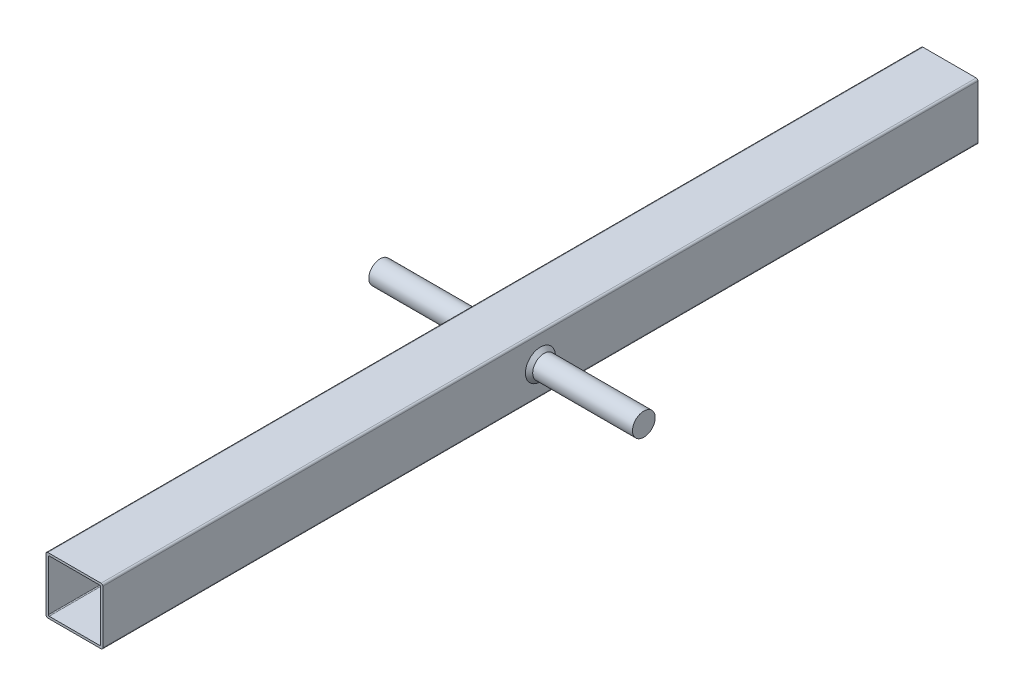
ISO-10303-21;
HEADER;
FILE_DESCRIPTION(('STEP AP214'),'2;1');
FILE_NAME('part.step','',(''),(''),'','','');
FILE_SCHEMA(('AUTOMOTIVE_DESIGN { 1 0 10303 214 1 1 1 1 }'));
ENDSEC;
DATA;
#1=APPLICATION_CONTEXT('core data for automotive mechanical design processes');
#2=APPLICATION_PROTOCOL_DEFINITION('international standard','automotive_design',2000,#1);
#3=PRODUCT_CONTEXT('',#1,'mechanical');
#4=PRODUCT('Part','Part','',(#3));
#5=PRODUCT_RELATED_PRODUCT_CATEGORY('part','',(#4));
#6=PRODUCT_DEFINITION_FORMATION('','',#4);
#7=PRODUCT_DEFINITION_CONTEXT('part definition',#1,'design');
#8=PRODUCT_DEFINITION('design','',#6,#7);
#9=PRODUCT_DEFINITION_SHAPE('','',#8);
#10=(LENGTH_UNIT() NAMED_UNIT(*) SI_UNIT(.MILLI.,.METRE.));
#11=(NAMED_UNIT(*) PLANE_ANGLE_UNIT() SI_UNIT($,.RADIAN.));
#12=(NAMED_UNIT(*) SI_UNIT($,.STERADIAN.) SOLID_ANGLE_UNIT());
#13=UNCERTAINTY_MEASURE_WITH_UNIT(LENGTH_MEASURE(1.E-05),#10,'distance_accuracy_value','');
#14=(GEOMETRIC_REPRESENTATION_CONTEXT(3) GLOBAL_UNCERTAINTY_ASSIGNED_CONTEXT((#13)) GLOBAL_UNIT_ASSIGNED_CONTEXT((#10,
#11,#12)) REPRESENTATION_CONTEXT('',''));
#15=CARTESIAN_POINT('',(0.,0.,0.));
#16=DIRECTION('',(0.,0.,1.));
#17=DIRECTION('',(1.,0.,0.));
#18=AXIS2_PLACEMENT_3D('',#15,#16,#17);
#19=CARTESIAN_POINT('',(0.,0.,305.59375));
#20=DIRECTION('',(0.,0.,1.));
#21=DIRECTION('',(1.,0.,0.));
#22=AXIS2_PLACEMENT_3D('',#19,#20,#21);
#23=PLANE('',#22);
#24=DIRECTION('',(1.,0.,0.));
#25=VECTOR('',#24,1.);
#26=CARTESIAN_POINT('',(19.84375,-19.84375,305.59375));
#27=LINE('',#26,#25);
#28=CARTESIAN_POINT('',(-18.57375,-19.84375,305.59375));
#29=VERTEX_POINT('',#28);
#30=CARTESIAN_POINT('',(18.57375,-19.84375,305.59375));
#31=VERTEX_POINT('',#30);
#32=EDGE_CURVE('E383',#29,#31,#27,.T.);
#33=ORIENTED_EDGE('',*,*,#32,.T.);
#34=CARTESIAN_POINT('',(18.57375,-18.57375,305.59375));
#35=DIRECTION('',(0.,0.,1.));
#36=DIRECTION('',(1.,0.,0.));
#37=AXIS2_PLACEMENT_3D('',#34,#35,#36);
#38=CIRCLE('',#37,1.27);
#39=CARTESIAN_POINT('',(19.84375,-18.57375,305.59375));
#40=VERTEX_POINT('',#39);
#41=EDGE_CURVE('E207',#31,#40,#38,.T.);
#42=ORIENTED_EDGE('',*,*,#41,.T.);
#43=DIRECTION('',(0.,1.,0.));
#44=VECTOR('',#43,1.);
#45=CARTESIAN_POINT('',(19.84375,-19.84375,305.59375));
#46=LINE('',#45,#44);
#47=CARTESIAN_POINT('',(19.84375,18.57375,305.59375));
#48=VERTEX_POINT('',#47);
#49=EDGE_CURVE('E175',#40,#48,#46,.T.);
#50=ORIENTED_EDGE('',*,*,#49,.T.);
#51=CARTESIAN_POINT('',(18.57375,18.57375,305.59375));
#52=DIRECTION('',(0.,0.,1.));
#53=DIRECTION('',(1.,0.,0.));
#54=AXIS2_PLACEMENT_3D('',#51,#52,#53);
#55=CIRCLE('',#54,1.27);
#56=CARTESIAN_POINT('',(18.57375,19.84375,305.59375));
#57=VERTEX_POINT('',#56);
#58=EDGE_CURVE('E201',#48,#57,#55,.T.);
#59=ORIENTED_EDGE('',*,*,#58,.T.);
#60=DIRECTION('',(-1.,0.,0.));
#61=VECTOR('',#60,1.);
#62=CARTESIAN_POINT('',(19.84375,19.84375,305.59375));
#63=LINE('',#62,#61);
#64=CARTESIAN_POINT('',(-18.57375,19.84375,305.59375));
#65=VERTEX_POINT('',#64);
#66=EDGE_CURVE('E192',#57,#65,#63,.T.);
#67=ORIENTED_EDGE('',*,*,#66,.T.);
#68=CARTESIAN_POINT('',(-18.57375,18.57375,305.59375));
#69=DIRECTION('',(0.,0.,1.));
#70=DIRECTION('',(1.,0.,0.));
#71=AXIS2_PLACEMENT_3D('',#68,#69,#70);
#72=CIRCLE('',#71,1.27);
#73=CARTESIAN_POINT('',(-19.84375,18.57375,305.59375));
#74=VERTEX_POINT('',#73);
#75=EDGE_CURVE('E203',#65,#74,#72,.T.);
#76=ORIENTED_EDGE('',*,*,#75,.T.);
#77=DIRECTION('',(0.,-1.,0.));
#78=VECTOR('',#77,1.);
#79=CARTESIAN_POINT('',(-19.84375,-19.84375,305.59375));
#80=LINE('',#79,#78);
#81=CARTESIAN_POINT('',(-19.84375,-18.57375,305.59375));
#82=VERTEX_POINT('',#81);
#83=EDGE_CURVE('E186',#74,#82,#80,.T.);
#84=ORIENTED_EDGE('',*,*,#83,.T.);
#85=CARTESIAN_POINT('',(-18.57375,-18.57375,305.59375));
#86=DIRECTION('',(0.,0.,1.));
#87=DIRECTION('',(1.,0.,0.));
#88=AXIS2_PLACEMENT_3D('',#85,#86,#87);
#89=CIRCLE('',#88,1.27);
#90=EDGE_CURVE('E205',#82,#29,#89,.T.);
#91=ORIENTED_EDGE('',*,*,#90,.T.);
#92=EDGE_LOOP('',(#33,#42,#50,#59,#67,#76,#84,#91));
#93=FACE_BOUND('',#92,.T.);
#94=DIRECTION('',(-1.,0.,0.));
#95=VECTOR('',#94,1.);
#96=CARTESIAN_POINT('',(-18.25625,18.25625,305.59375));
#97=LINE('',#96,#95);
#98=CARTESIAN_POINT('',(17.62125,18.25625,305.59375));
#99=VERTEX_POINT('',#98);
#100=CARTESIAN_POINT('',(-17.62125,18.25625,305.59375));
#101=VERTEX_POINT('',#100);
#102=EDGE_CURVE('E352',#99,#101,#97,.T.);
#103=ORIENTED_EDGE('',*,*,#102,.F.);
#104=CARTESIAN_POINT('',(17.62125,17.62125,305.59375));
#105=DIRECTION('',(0.,0.,1.));
#106=DIRECTION('',(1.,0.,0.));
#107=AXIS2_PLACEMENT_3D('',#104,#105,#106);
#108=CIRCLE('',#107,0.635);
#109=CARTESIAN_POINT('',(18.25625,17.62125,305.59375));
#110=VERTEX_POINT('',#109);
#111=EDGE_CURVE('E244',#99,#110,#108,.F.);
#112=ORIENTED_EDGE('',*,*,#111,.T.);
#113=DIRECTION('',(0.,1.,0.));
#114=VECTOR('',#113,1.);
#115=CARTESIAN_POINT('',(18.25625,18.25625,305.59375));
#116=LINE('',#115,#114);
#117=CARTESIAN_POINT('',(18.25625,-17.62125,305.59375));
#118=VERTEX_POINT('',#117);
#119=EDGE_CURVE('E360',#118,#110,#116,.T.);
#120=ORIENTED_EDGE('',*,*,#119,.F.);
#121=CARTESIAN_POINT('',(17.62125,-17.62125,305.59375));
#122=DIRECTION('',(0.,0.,1.));
#123=DIRECTION('',(1.,0.,0.));
#124=AXIS2_PLACEMENT_3D('',#121,#122,#123);
#125=CIRCLE('',#124,0.635);
#126=CARTESIAN_POINT('',(17.62125,-18.25625,305.59375));
#127=VERTEX_POINT('',#126);
#128=EDGE_CURVE('E240',#118,#127,#125,.F.);
#129=ORIENTED_EDGE('',*,*,#128,.T.);
#130=DIRECTION('',(1.,0.,0.));
#131=VECTOR('',#130,1.);
#132=CARTESIAN_POINT('',(-18.25625,-18.25625,305.59375));
#133=LINE('',#132,#131);
#134=CARTESIAN_POINT('',(-17.62125,-18.25625,305.59375));
#135=VERTEX_POINT('',#134);
#136=EDGE_CURVE('E362',#135,#127,#133,.T.);
#137=ORIENTED_EDGE('',*,*,#136,.F.);
#138=CARTESIAN_POINT('',(-17.62125,-17.62125,305.59375));
#139=DIRECTION('',(0.,0.,1.));
#140=DIRECTION('',(1.,0.,0.));
#141=AXIS2_PLACEMENT_3D('',#138,#139,#140);
#142=CIRCLE('',#141,0.635);
#143=CARTESIAN_POINT('',(-18.25625,-17.62125,305.59375));
#144=VERTEX_POINT('',#143);
#145=EDGE_CURVE('E55',#135,#144,#142,.F.);
#146=ORIENTED_EDGE('',*,*,#145,.T.);
#147=DIRECTION('',(0.,-1.,0.));
#148=VECTOR('',#147,1.);
#149=CARTESIAN_POINT('',(-18.25625,18.25625,305.59375));
#150=LINE('',#149,#148);
#151=CARTESIAN_POINT('',(-18.25625,17.62125,305.59375));
#152=VERTEX_POINT('',#151);
#153=EDGE_CURVE('E354',#152,#144,#150,.T.);
#154=ORIENTED_EDGE('',*,*,#153,.F.);
#155=CARTESIAN_POINT('',(-17.62125,17.62125,305.59375));
#156=DIRECTION('',(0.,0.,1.));
#157=DIRECTION('',(1.,0.,0.));
#158=AXIS2_PLACEMENT_3D('',#155,#156,#157);
#159=CIRCLE('',#158,0.635);
#160=EDGE_CURVE('E251',#152,#101,#159,.F.);
#161=ORIENTED_EDGE('',*,*,#160,.T.);
#162=EDGE_LOOP('',(#103,#112,#120,#129,#137,#146,#154,#161));
#163=FACE_BOUND('',#162,.T.);
#164=ADVANCED_FACE('F39',(#93,#163),#23,.T.);
#165=CARTESIAN_POINT('',(0.,0.,-305.59375));
#166=DIRECTION('',(0.,0.,1.));
#167=DIRECTION('',(1.,0.,0.));
#168=AXIS2_PLACEMENT_3D('',#165,#166,#167);
#169=PLANE('',#168);
#170=DIRECTION('',(0.,1.,0.));
#171=VECTOR('',#170,1.);
#172=CARTESIAN_POINT('',(19.84375,-19.84375,-305.59375));
#173=LINE('',#172,#171);
#174=CARTESIAN_POINT('',(19.84375,-18.57375,-305.59375));
#175=VERTEX_POINT('',#174);
#176=CARTESIAN_POINT('',(19.84375,18.57375,-305.59375));
#177=VERTEX_POINT('',#176);
#178=EDGE_CURVE('E172',#175,#177,#173,.T.);
#179=ORIENTED_EDGE('',*,*,#178,.F.);
#180=CARTESIAN_POINT('',(18.57375,-18.57375,-305.59375));
#181=DIRECTION('',(0.,0.,1.));
#182=DIRECTION('',(1.,0.,0.));
#183=AXIS2_PLACEMENT_3D('',#180,#181,#182);
#184=CIRCLE('',#183,1.27);
#185=CARTESIAN_POINT('',(18.57375,-19.84375,-305.59375));
#186=VERTEX_POINT('',#185);
#187=EDGE_CURVE('E155',#175,#186,#184,.F.);
#188=ORIENTED_EDGE('',*,*,#187,.T.);
#189=DIRECTION('',(1.,0.,0.));
#190=VECTOR('',#189,1.);
#191=CARTESIAN_POINT('',(19.84375,-19.84375,-305.59375));
#192=LINE('',#191,#190);
#193=CARTESIAN_POINT('',(-18.57375,-19.84375,-305.59375));
#194=VERTEX_POINT('',#193);
#195=EDGE_CURVE('E183',#194,#186,#192,.T.);
#196=ORIENTED_EDGE('',*,*,#195,.F.);
#197=CARTESIAN_POINT('',(-18.57375,-18.57375,-305.59375));
#198=DIRECTION('',(0.,0.,1.));
#199=DIRECTION('',(1.,0.,0.));
#200=AXIS2_PLACEMENT_3D('',#197,#198,#199);
#201=CIRCLE('',#200,1.27);
#202=CARTESIAN_POINT('',(-19.84375,-18.57375,-305.59375));
#203=VERTEX_POINT('',#202);
#204=EDGE_CURVE('E166',#194,#203,#201,.F.);
#205=ORIENTED_EDGE('',*,*,#204,.T.);
#206=DIRECTION('',(0.,-1.,0.));
#207=VECTOR('',#206,1.);
#208=CARTESIAN_POINT('',(-19.84375,-19.84375,-305.59375));
#209=LINE('',#208,#207);
#210=CARTESIAN_POINT('',(-19.84375,18.57375,-305.59375));
#211=VERTEX_POINT('',#210);
#212=EDGE_CURVE('E188',#211,#203,#209,.T.);
#213=ORIENTED_EDGE('',*,*,#212,.F.);
#214=CARTESIAN_POINT('',(-18.57375,18.57375,-305.59375));
#215=DIRECTION('',(0.,0.,1.));
#216=DIRECTION('',(1.,0.,0.));
#217=AXIS2_PLACEMENT_3D('',#214,#215,#216);
#218=CIRCLE('',#217,1.27);
#219=CARTESIAN_POINT('',(-18.57375,19.84375,-305.59375));
#220=VERTEX_POINT('',#219);
#221=EDGE_CURVE('E195',#211,#220,#218,.F.);
#222=ORIENTED_EDGE('',*,*,#221,.T.);
#223=DIRECTION('',(-1.,0.,0.));
#224=VECTOR('',#223,1.);
#225=CARTESIAN_POINT('',(19.84375,19.84375,-305.59375));
#226=LINE('',#225,#224);
#227=CARTESIAN_POINT('',(18.57375,19.84375,-305.59375));
#228=VERTEX_POINT('',#227);
#229=EDGE_CURVE('E182',#228,#220,#226,.T.);
#230=ORIENTED_EDGE('',*,*,#229,.F.);
#231=CARTESIAN_POINT('',(18.57375,18.57375,-305.59375));
#232=DIRECTION('',(0.,0.,1.));
#233=DIRECTION('',(1.,0.,0.));
#234=AXIS2_PLACEMENT_3D('',#231,#232,#233);
#235=CIRCLE('',#234,1.27);
#236=EDGE_CURVE('E176',#228,#177,#235,.F.);
#237=ORIENTED_EDGE('',*,*,#236,.T.);
#238=EDGE_LOOP('',(#179,#188,#196,#205,#213,#222,#230,#237));
#239=FACE_BOUND('',#238,.T.);
#240=DIRECTION('',(1.,0.,0.));
#241=VECTOR('',#240,1.);
#242=CARTESIAN_POINT('',(-18.25625,-18.25625,-305.59375));
#243=LINE('',#242,#241);
#244=CARTESIAN_POINT('',(-17.62125,-18.25625,-305.59375));
#245=VERTEX_POINT('',#244);
#246=CARTESIAN_POINT('',(17.62125,-18.25625,-305.59375));
#247=VERTEX_POINT('',#246);
#248=EDGE_CURVE('E365',#245,#247,#243,.T.);
#249=ORIENTED_EDGE('',*,*,#248,.T.);
#250=CARTESIAN_POINT('',(17.62125,-17.62125,-305.59375));
#251=DIRECTION('',(0.,0.,1.));
#252=DIRECTION('',(1.,0.,0.));
#253=AXIS2_PLACEMENT_3D('',#250,#251,#252);
#254=CIRCLE('',#253,0.635);
#255=CARTESIAN_POINT('',(18.25625,-17.62125,-305.59375));
#256=VERTEX_POINT('',#255);
#257=EDGE_CURVE('E238',#247,#256,#254,.T.);
#258=ORIENTED_EDGE('',*,*,#257,.T.);
#259=DIRECTION('',(0.,1.,0.));
#260=VECTOR('',#259,1.);
#261=CARTESIAN_POINT('',(18.25625,18.25625,-305.59375));
#262=LINE('',#261,#260);
#263=CARTESIAN_POINT('',(18.25625,17.62125,-305.59375));
#264=VERTEX_POINT('',#263);
#265=EDGE_CURVE('E371',#256,#264,#262,.T.);
#266=ORIENTED_EDGE('',*,*,#265,.T.);
#267=CARTESIAN_POINT('',(17.62125,17.62125,-305.59375));
#268=DIRECTION('',(0.,0.,1.));
#269=DIRECTION('',(1.,0.,0.));
#270=AXIS2_PLACEMENT_3D('',#267,#268,#269);
#271=CIRCLE('',#270,0.635);
#272=CARTESIAN_POINT('',(17.62125,18.25625,-305.59375));
#273=VERTEX_POINT('',#272);
#274=EDGE_CURVE('E242',#264,#273,#271,.T.);
#275=ORIENTED_EDGE('',*,*,#274,.T.);
#276=DIRECTION('',(-1.,0.,0.));
#277=VECTOR('',#276,1.);
#278=CARTESIAN_POINT('',(-18.25625,18.25625,-305.59375));
#279=LINE('',#278,#277);
#280=CARTESIAN_POINT('',(-17.62125,18.25625,-305.59375));
#281=VERTEX_POINT('',#280);
#282=EDGE_CURVE('E374',#273,#281,#279,.T.);
#283=ORIENTED_EDGE('',*,*,#282,.T.);
#284=CARTESIAN_POINT('',(-17.62125,17.62125,-305.59375));
#285=DIRECTION('',(0.,0.,1.));
#286=DIRECTION('',(1.,0.,0.));
#287=AXIS2_PLACEMENT_3D('',#284,#285,#286);
#288=CIRCLE('',#287,0.635);
#289=CARTESIAN_POINT('',(-18.25625,17.62125,-305.59375));
#290=VERTEX_POINT('',#289);
#291=EDGE_CURVE('E249',#281,#290,#288,.T.);
#292=ORIENTED_EDGE('',*,*,#291,.T.);
#293=DIRECTION('',(0.,-1.,0.));
#294=VECTOR('',#293,1.);
#295=CARTESIAN_POINT('',(-18.25625,18.25625,-305.59375));
#296=LINE('',#295,#294);
#297=CARTESIAN_POINT('',(-18.25625,-17.62125,-305.59375));
#298=VERTEX_POINT('',#297);
#299=EDGE_CURVE('E376',#290,#298,#296,.T.);
#300=ORIENTED_EDGE('',*,*,#299,.T.);
#301=CARTESIAN_POINT('',(-17.62125,-17.62125,-305.59375));
#302=DIRECTION('',(0.,0.,1.));
#303=DIRECTION('',(1.,0.,0.));
#304=AXIS2_PLACEMENT_3D('',#301,#302,#303);
#305=CIRCLE('',#304,0.635);
#306=EDGE_CURVE('E246',#298,#245,#305,.T.);
#307=ORIENTED_EDGE('',*,*,#306,.T.);
#308=EDGE_LOOP('',(#249,#258,#266,#275,#283,#292,#300,#307));
#309=FACE_BOUND('',#308,.T.);
#310=ADVANCED_FACE('F179',(#239,#309),#169,.F.);
#311=CARTESIAN_POINT('',(-19.84375,-19.84375,305.59375));
#312=DIRECTION('',(1.,0.,0.));
#313=DIRECTION('',(0.,0.,-1.));
#314=AXIS2_PLACEMENT_3D('',#311,#312,#313);
#315=PLANE('',#314);
#316=CARTESIAN_POINT('',(-19.84375,0.,0.));
#317=DIRECTION('',(1.,0.,0.));
#318=DIRECTION('',(0.,0.,-1.));
#319=AXIS2_PLACEMENT_3D('',#316,#317,#318);
#320=CIRCLE('',#319,10.4774999999999);
#321=CARTESIAN_POINT('',(-19.84375,0.,-10.4774999999999));
#322=VERTEX_POINT('',#321);
#323=EDGE_CURVE('E11',#322,#322,#320,.T.);
#324=ORIENTED_EDGE('',*,*,#323,.T.);
#325=EDGE_LOOP('',(#324));
#326=FACE_BOUND('',#325,.T.);
#327=ORIENTED_EDGE('',*,*,#212,.T.);
#328=DIRECTION('',(0.,0.,-1.));
#329=VECTOR('',#328,1.);
#330=CARTESIAN_POINT('',(-19.84375,-18.57375,305.59375));
#331=LINE('',#330,#329);
#332=EDGE_CURVE('E212',#203,#82,#331,.F.);
#333=ORIENTED_EDGE('',*,*,#332,.T.);
#334=ORIENTED_EDGE('',*,*,#83,.F.);
#335=DIRECTION('',(0.,0.,-1.));
#336=VECTOR('',#335,1.);
#337=CARTESIAN_POINT('',(-19.84375,18.57375,305.59375));
#338=LINE('',#337,#336);
#339=EDGE_CURVE('E209',#74,#211,#338,.T.);
#340=ORIENTED_EDGE('',*,*,#339,.T.);
#341=EDGE_LOOP('',(#327,#333,#334,#340));
#342=FACE_BOUND('',#341,.T.);
#343=ADVANCED_FACE('F284',(#326,#342),#315,.F.);
#344=CARTESIAN_POINT('',(19.84375,-19.84375,305.59375));
#345=DIRECTION('',(0.,1.,0.));
#346=DIRECTION('',(-1.,0.,0.));
#347=AXIS2_PLACEMENT_3D('',#344,#345,#346);
#348=PLANE('',#347);
#349=ORIENTED_EDGE('',*,*,#195,.T.);
#350=DIRECTION('',(0.,0.,-1.));
#351=VECTOR('',#350,1.);
#352=CARTESIAN_POINT('',(18.57375,-19.84375,305.59375));
#353=LINE('',#352,#351);
#354=EDGE_CURVE('E160',#186,#31,#353,.F.);
#355=ORIENTED_EDGE('',*,*,#354,.T.);
#356=ORIENTED_EDGE('',*,*,#32,.F.);
#357=DIRECTION('',(0.,0.,-1.));
#358=VECTOR('',#357,1.);
#359=CARTESIAN_POINT('',(-18.57375,-19.84375,305.59375));
#360=LINE('',#359,#358);
#361=EDGE_CURVE('E165',#29,#194,#360,.T.);
#362=ORIENTED_EDGE('',*,*,#361,.T.);
#363=EDGE_LOOP('',(#349,#355,#356,#362));
#364=FACE_BOUND('',#363,.T.);
#365=ADVANCED_FACE('F297',(#364),#348,.F.);
#366=CARTESIAN_POINT('',(19.84375,-19.84375,305.59375));
#367=DIRECTION('',(-1.,0.,0.));
#368=DIRECTION('',(0.,0.,1.));
#369=AXIS2_PLACEMENT_3D('',#366,#367,#368);
#370=PLANE('',#369);
#371=CARTESIAN_POINT('',(19.84375,0.,0.));
#372=DIRECTION('',(-1.,0.,0.));
#373=DIRECTION('',(0.,0.,1.));
#374=AXIS2_PLACEMENT_3D('',#371,#372,#373);
#375=CIRCLE('',#374,10.4775);
#376=CARTESIAN_POINT('',(19.84375,0.,10.4775));
#377=VERTEX_POINT('',#376);
#378=EDGE_CURVE('E261',#377,#377,#375,.T.);
#379=ORIENTED_EDGE('',*,*,#378,.T.);
#380=EDGE_LOOP('',(#379));
#381=FACE_BOUND('',#380,.T.);
#382=ORIENTED_EDGE('',*,*,#49,.F.);
#383=DIRECTION('',(0.,0.,-1.));
#384=VECTOR('',#383,1.);
#385=CARTESIAN_POINT('',(19.84375,-18.57375,305.59375));
#386=LINE('',#385,#384);
#387=EDGE_CURVE('E159',#40,#175,#386,.T.);
#388=ORIENTED_EDGE('',*,*,#387,.T.);
#389=ORIENTED_EDGE('',*,*,#178,.T.);
#390=DIRECTION('',(0.,0.,-1.));
#391=VECTOR('',#390,1.);
#392=CARTESIAN_POINT('',(19.84375,18.57375,305.59375));
#393=LINE('',#392,#391);
#394=EDGE_CURVE('E177',#177,#48,#393,.F.);
#395=ORIENTED_EDGE('',*,*,#394,.T.);
#396=EDGE_LOOP('',(#382,#388,#389,#395));
#397=FACE_BOUND('',#396,.T.);
#398=ADVANCED_FACE('F171',(#381,#397),#370,.F.);
#399=CARTESIAN_POINT('',(19.84375,19.84375,305.59375));
#400=DIRECTION('',(0.,-1.,0.));
#401=DIRECTION('',(1.,0.,0.));
#402=AXIS2_PLACEMENT_3D('',#399,#400,#401);
#403=PLANE('',#402);
#404=ORIENTED_EDGE('',*,*,#229,.T.);
#405=DIRECTION('',(0.,0.,-1.));
#406=VECTOR('',#405,1.);
#407=CARTESIAN_POINT('',(-18.57375,19.84375,305.59375));
#408=LINE('',#407,#406);
#409=EDGE_CURVE('E217',#220,#65,#408,.F.);
#410=ORIENTED_EDGE('',*,*,#409,.T.);
#411=ORIENTED_EDGE('',*,*,#66,.F.);
#412=DIRECTION('',(0.,0.,-1.));
#413=VECTOR('',#412,1.);
#414=CARTESIAN_POINT('',(18.57375,19.84375,305.59375));
#415=LINE('',#414,#413);
#416=EDGE_CURVE('E214',#57,#228,#415,.T.);
#417=ORIENTED_EDGE('',*,*,#416,.T.);
#418=EDGE_LOOP('',(#404,#410,#411,#417));
#419=FACE_BOUND('',#418,.T.);
#420=ADVANCED_FACE('F291',(#419),#403,.F.);
#421=CARTESIAN_POINT('',(18.25625,18.25625,305.59375));
#422=DIRECTION('',(-1.,0.,0.));
#423=DIRECTION('',(0.,-1.,0.));
#424=AXIS2_PLACEMENT_3D('',#421,#422,#423);
#425=PLANE('',#424);
#426=CARTESIAN_POINT('',(18.25625,0.,0.));
#427=DIRECTION('',(-1.,0.,0.));
#428=DIRECTION('',(0.,-1.,0.));
#429=AXIS2_PLACEMENT_3D('',#426,#427,#428);
#430=CIRCLE('',#429,7.9375);
#431=CARTESIAN_POINT('',(18.25625,-7.9375,0.));
#432=VERTEX_POINT('',#431);
#433=EDGE_CURVE('E257',#432,#432,#430,.F.);
#434=ORIENTED_EDGE('',*,*,#433,.T.);
#435=EDGE_LOOP('',(#434));
#436=FACE_BOUND('',#435,.T.);
#437=ORIENTED_EDGE('',*,*,#265,.F.);
#438=DIRECTION('',(0.,0.,-1.));
#439=VECTOR('',#438,1.);
#440=CARTESIAN_POINT('',(18.25625,-17.62125,305.59375));
#441=LINE('',#440,#439);
#442=EDGE_CURVE('E227',#256,#118,#441,.F.);
#443=ORIENTED_EDGE('',*,*,#442,.T.);
#444=ORIENTED_EDGE('',*,*,#119,.T.);
#445=DIRECTION('',(0.,0.,-1.));
#446=VECTOR('',#445,1.);
#447=CARTESIAN_POINT('',(18.25625,17.62125,-305.59375));
#448=LINE('',#447,#446);
#449=EDGE_CURVE('E224',#110,#264,#448,.T.);
#450=ORIENTED_EDGE('',*,*,#449,.T.);
#451=EDGE_LOOP('',(#437,#443,#444,#450));
#452=FACE_BOUND('',#451,.T.);
#453=ADVANCED_FACE('F288',(#436,#452),#425,.T.);
#454=CARTESIAN_POINT('',(-18.25625,18.25625,305.59375));
#455=DIRECTION('',(0.,-1.,0.));
#456=DIRECTION('',(0.,0.,-1.));
#457=AXIS2_PLACEMENT_3D('',#454,#455,#456);
#458=PLANE('',#457);
#459=ORIENTED_EDGE('',*,*,#282,.F.);
#460=DIRECTION('',(0.,0.,-1.));
#461=VECTOR('',#460,1.);
#462=CARTESIAN_POINT('',(17.62125,18.25625,305.59375));
#463=LINE('',#462,#461);
#464=EDGE_CURVE('E232',#273,#99,#463,.F.);
#465=ORIENTED_EDGE('',*,*,#464,.T.);
#466=ORIENTED_EDGE('',*,*,#102,.T.);
#467=DIRECTION('',(0.,0.,-1.));
#468=VECTOR('',#467,1.);
#469=CARTESIAN_POINT('',(-17.62125,18.25625,-305.59375));
#470=LINE('',#469,#468);
#471=EDGE_CURVE('E229',#101,#281,#470,.T.);
#472=ORIENTED_EDGE('',*,*,#471,.T.);
#473=EDGE_LOOP('',(#459,#465,#466,#472));
#474=FACE_BOUND('',#473,.T.);
#475=ADVANCED_FACE('F357',(#474),#458,.T.);
#476=CARTESIAN_POINT('',(-18.25625,18.25625,305.59375));
#477=DIRECTION('',(1.,0.,0.));
#478=DIRECTION('',(0.,1.,0.));
#479=AXIS2_PLACEMENT_3D('',#476,#477,#478);
#480=PLANE('',#479);
#481=CARTESIAN_POINT('',(-18.25625,0.,0.));
#482=DIRECTION('',(1.,0.,0.));
#483=DIRECTION('',(0.,1.,0.));
#484=AXIS2_PLACEMENT_3D('',#481,#482,#483);
#485=CIRCLE('',#484,7.9375);
#486=CARTESIAN_POINT('',(-18.25625,7.9375,0.));
#487=VERTEX_POINT('',#486);
#488=EDGE_CURVE('E254',#487,#487,#485,.F.);
#489=ORIENTED_EDGE('',*,*,#488,.T.);
#490=EDGE_LOOP('',(#489));
#491=FACE_BOUND('',#490,.T.);
#492=ORIENTED_EDGE('',*,*,#153,.T.);
#493=DIRECTION('',(0.,0.,-1.));
#494=VECTOR('',#493,1.);
#495=CARTESIAN_POINT('',(-18.25625,-17.62125,-305.59375));
#496=LINE('',#495,#494);
#497=EDGE_CURVE('E235',#144,#298,#496,.T.);
#498=ORIENTED_EDGE('',*,*,#497,.T.);
#499=ORIENTED_EDGE('',*,*,#299,.F.);
#500=DIRECTION('',(0.,0.,-1.));
#501=VECTOR('',#500,1.);
#502=CARTESIAN_POINT('',(-18.25625,17.62125,305.59375));
#503=LINE('',#502,#501);
#504=EDGE_CURVE('E62',#290,#152,#503,.F.);
#505=ORIENTED_EDGE('',*,*,#504,.T.);
#506=EDGE_LOOP('',(#492,#498,#499,#505));
#507=FACE_BOUND('',#506,.T.);
#508=ADVANCED_FACE('F407',(#491,#507),#480,.T.);
#509=CARTESIAN_POINT('',(-18.25625,-18.25625,305.59375));
#510=DIRECTION('',(0.,1.,0.));
#511=DIRECTION('',(0.,0.,1.));
#512=AXIS2_PLACEMENT_3D('',#509,#510,#511);
#513=PLANE('',#512);
#514=ORIENTED_EDGE('',*,*,#136,.T.);
#515=DIRECTION('',(0.,0.,-1.));
#516=VECTOR('',#515,1.);
#517=CARTESIAN_POINT('',(17.62125,-18.25625,-305.59375));
#518=LINE('',#517,#516);
#519=EDGE_CURVE('E221',#127,#247,#518,.T.);
#520=ORIENTED_EDGE('',*,*,#519,.T.);
#521=ORIENTED_EDGE('',*,*,#248,.F.);
#522=DIRECTION('',(0.,0.,-1.));
#523=VECTOR('',#522,1.);
#524=CARTESIAN_POINT('',(-17.62125,-18.25625,305.59375));
#525=LINE('',#524,#523);
#526=EDGE_CURVE('E219',#245,#135,#525,.F.);
#527=ORIENTED_EDGE('',*,*,#526,.T.);
#528=EDGE_LOOP('',(#514,#520,#521,#527));
#529=FACE_BOUND('',#528,.T.);
#530=ADVANCED_FACE('F308',(#529),#513,.T.);
#531=CARTESIAN_POINT('',(18.57375,-18.57375,305.59375));
#532=DIRECTION('',(0.,0.,-1.));
#533=DIRECTION('',(-1.,0.,0.));
#534=AXIS2_PLACEMENT_3D('',#531,#532,#533);
#535=CYLINDRICAL_SURFACE('',#534,1.27);
#536=ORIENTED_EDGE('',*,*,#41,.F.);
#537=ORIENTED_EDGE('',*,*,#354,.F.);
#538=ORIENTED_EDGE('',*,*,#187,.F.);
#539=ORIENTED_EDGE('',*,*,#387,.F.);
#540=EDGE_LOOP('',(#536,#537,#538,#539));
#541=FACE_BOUND('',#540,.T.);
#542=ADVANCED_FACE('F158',(#541),#535,.T.);
#543=CARTESIAN_POINT('',(-18.57375,-18.57375,305.59375));
#544=DIRECTION('',(0.,0.,-1.));
#545=DIRECTION('',(-1.,0.,0.));
#546=AXIS2_PLACEMENT_3D('',#543,#544,#545);
#547=CYLINDRICAL_SURFACE('',#546,1.27);
#548=ORIENTED_EDGE('',*,*,#90,.F.);
#549=ORIENTED_EDGE('',*,*,#332,.F.);
#550=ORIENTED_EDGE('',*,*,#204,.F.);
#551=ORIENTED_EDGE('',*,*,#361,.F.);
#552=EDGE_LOOP('',(#548,#549,#550,#551));
#553=FACE_BOUND('',#552,.T.);
#554=ADVANCED_FACE('F307',(#553),#547,.T.);
#555=CARTESIAN_POINT('',(-18.57375,18.57375,305.59375));
#556=DIRECTION('',(0.,0.,-1.));
#557=DIRECTION('',(-1.,0.,0.));
#558=AXIS2_PLACEMENT_3D('',#555,#556,#557);
#559=CYLINDRICAL_SURFACE('',#558,1.27);
#560=ORIENTED_EDGE('',*,*,#75,.F.);
#561=ORIENTED_EDGE('',*,*,#409,.F.);
#562=ORIENTED_EDGE('',*,*,#221,.F.);
#563=ORIENTED_EDGE('',*,*,#339,.F.);
#564=EDGE_LOOP('',(#560,#561,#562,#563));
#565=FACE_BOUND('',#564,.T.);
#566=ADVANCED_FACE('F311',(#565),#559,.T.);
#567=CARTESIAN_POINT('',(18.57375,18.57375,305.59375));
#568=DIRECTION('',(0.,0.,-1.));
#569=DIRECTION('',(-1.,0.,0.));
#570=AXIS2_PLACEMENT_3D('',#567,#568,#569);
#571=CYLINDRICAL_SURFACE('',#570,1.27);
#572=ORIENTED_EDGE('',*,*,#58,.F.);
#573=ORIENTED_EDGE('',*,*,#394,.F.);
#574=ORIENTED_EDGE('',*,*,#236,.F.);
#575=ORIENTED_EDGE('',*,*,#416,.F.);
#576=EDGE_LOOP('',(#572,#573,#574,#575));
#577=FACE_BOUND('',#576,.T.);
#578=ADVANCED_FACE('F315',(#577),#571,.T.);
#579=CARTESIAN_POINT('',(17.62125,-17.62125,305.59375));
#580=DIRECTION('',(0.,0.,1.));
#581=DIRECTION('',(1.,0.,0.));
#582=AXIS2_PLACEMENT_3D('',#579,#580,#581);
#583=CYLINDRICAL_SURFACE('',#582,0.635);
#584=ORIENTED_EDGE('',*,*,#128,.F.);
#585=ORIENTED_EDGE('',*,*,#442,.F.);
#586=ORIENTED_EDGE('',*,*,#257,.F.);
#587=ORIENTED_EDGE('',*,*,#519,.F.);
#588=EDGE_LOOP('',(#584,#585,#586,#587));
#589=FACE_BOUND('',#588,.T.);
#590=ADVANCED_FACE('F319',(#589),#583,.F.);
#591=CARTESIAN_POINT('',(17.62125,17.62125,305.59375));
#592=DIRECTION('',(0.,0.,1.));
#593=DIRECTION('',(1.,0.,0.));
#594=AXIS2_PLACEMENT_3D('',#591,#592,#593);
#595=CYLINDRICAL_SURFACE('',#594,0.635);
#596=ORIENTED_EDGE('',*,*,#111,.F.);
#597=ORIENTED_EDGE('',*,*,#464,.F.);
#598=ORIENTED_EDGE('',*,*,#274,.F.);
#599=ORIENTED_EDGE('',*,*,#449,.F.);
#600=EDGE_LOOP('',(#596,#597,#598,#599));
#601=FACE_BOUND('',#600,.T.);
#602=ADVANCED_FACE('F323',(#601),#595,.F.);
#603=CARTESIAN_POINT('',(-17.62125,-17.62125,305.59375));
#604=DIRECTION('',(0.,0.,1.));
#605=DIRECTION('',(1.,0.,0.));
#606=AXIS2_PLACEMENT_3D('',#603,#604,#605);
#607=CYLINDRICAL_SURFACE('',#606,0.635);
#608=ORIENTED_EDGE('',*,*,#145,.F.);
#609=ORIENTED_EDGE('',*,*,#526,.F.);
#610=ORIENTED_EDGE('',*,*,#306,.F.);
#611=ORIENTED_EDGE('',*,*,#497,.F.);
#612=EDGE_LOOP('',(#608,#609,#610,#611));
#613=FACE_BOUND('',#612,.T.);
#614=ADVANCED_FACE('F327',(#613),#607,.F.);
#615=CARTESIAN_POINT('',(-17.62125,17.62125,305.59375));
#616=DIRECTION('',(0.,0.,1.));
#617=DIRECTION('',(1.,0.,0.));
#618=AXIS2_PLACEMENT_3D('',#615,#616,#617);
#619=CYLINDRICAL_SURFACE('',#618,0.635);
#620=ORIENTED_EDGE('',*,*,#160,.F.);
#621=ORIENTED_EDGE('',*,*,#504,.F.);
#622=ORIENTED_EDGE('',*,*,#291,.F.);
#623=ORIENTED_EDGE('',*,*,#471,.F.);
#624=EDGE_LOOP('',(#620,#621,#622,#623));
#625=FACE_BOUND('',#624,.T.);
#626=ADVANCED_FACE('F331',(#625),#619,.F.);
#627=CARTESIAN_POINT('',(92.075,0.,0.));
#628=DIRECTION('',(-1.,0.,0.));
#629=DIRECTION('',(0.,0.,1.));
#630=AXIS2_PLACEMENT_3D('',#627,#628,#629);
#631=CYLINDRICAL_SURFACE('',#630,7.9375);
#632=ORIENTED_EDGE('',*,*,#433,.F.);
#633=EDGE_LOOP('',(#632));
#634=FACE_BOUND('',#633,.T.);
#635=ORIENTED_EDGE('',*,*,#488,.F.);
#636=EDGE_LOOP('',(#635));
#637=FACE_BOUND('',#636,.T.);
#638=ADVANCED_FACE('F334',(#634,#637),#631,.T.);
#639=CARTESIAN_POINT('',(92.075,0.,0.));
#640=DIRECTION('',(1.,0.,0.));
#641=DIRECTION('',(0.,0.,-1.));
#642=AXIS2_PLACEMENT_3D('',#639,#640,#641);
#643=PLANE('',#642);
#644=CARTESIAN_POINT('',(92.075,0.,0.));
#645=DIRECTION('',(1.,0.,0.));
#646=DIRECTION('',(0.,0.,-1.));
#647=AXIS2_PLACEMENT_3D('',#644,#645,#646);
#648=CIRCLE('',#647,7.9375);
#649=CARTESIAN_POINT('',(92.075,0.,-7.9375));
#650=VERTEX_POINT('',#649);
#651=EDGE_CURVE('E258',#650,#650,#648,.T.);
#652=ORIENTED_EDGE('',*,*,#651,.T.);
#653=EDGE_LOOP('',(#652));
#654=FACE_BOUND('',#653,.T.);
#655=ADVANCED_FACE('F344',(#654),#643,.T.);
#656=CARTESIAN_POINT('',(22.38375,0.,0.));
#657=DIRECTION('',(-1.,0.,0.));
#658=DIRECTION('',(0.,0.,1.));
#659=AXIS2_PLACEMENT_3D('',#656,#657,#658);
#660=CIRCLE('',#659,7.9375);
#661=CARTESIAN_POINT('',(22.38375,0.,7.9375));
#662=VERTEX_POINT('',#661);
#663=EDGE_CURVE('E253',#662,#662,#660,.F.);
#664=ORIENTED_EDGE('',*,*,#663,.T.);
#665=EDGE_LOOP('',(#664));
#666=FACE_BOUND('',#665,.T.);
#667=ORIENTED_EDGE('',*,*,#651,.F.);
#668=EDGE_LOOP('',(#667));
#669=FACE_BOUND('',#668,.T.);
#670=ADVANCED_FACE('F347',(#666,#669),#631,.T.);
#671=CARTESIAN_POINT('',(-22.3837499999999,0.,0.));
#672=DIRECTION('',(1.,0.,0.));
#673=DIRECTION('',(0.,0.,-1.));
#674=AXIS2_PLACEMENT_3D('',#671,#672,#673);
#675=CIRCLE('',#674,7.9375);
#676=CARTESIAN_POINT('',(-22.3837499999999,0.,-7.9375));
#677=VERTEX_POINT('',#676);
#678=EDGE_CURVE('E48',#677,#677,#675,.F.);
#679=ORIENTED_EDGE('',*,*,#678,.T.);
#680=EDGE_LOOP('',(#679));
#681=FACE_BOUND('',#680,.T.);
#682=CARTESIAN_POINT('',(-92.075,0.,0.));
#683=DIRECTION('',(1.,0.,0.));
#684=DIRECTION('',(0.,0.,-1.));
#685=AXIS2_PLACEMENT_3D('',#682,#683,#684);
#686=CIRCLE('',#685,7.9375);
#687=CARTESIAN_POINT('',(-92.075,0.,-7.9375));
#688=VERTEX_POINT('',#687);
#689=EDGE_CURVE('E421',#688,#688,#686,.T.);
#690=ORIENTED_EDGE('',*,*,#689,.T.);
#691=EDGE_LOOP('',(#690));
#692=FACE_BOUND('',#691,.T.);
#693=ADVANCED_FACE('F266',(#681,#692),#631,.T.);
#694=CARTESIAN_POINT('',(-92.075,0.,0.));
#695=DIRECTION('',(1.,0.,0.));
#696=DIRECTION('',(0.,0.,-1.));
#697=AXIS2_PLACEMENT_3D('',#694,#695,#696);
#698=PLANE('',#697);
#699=ORIENTED_EDGE('',*,*,#689,.F.);
#700=EDGE_LOOP('',(#699));
#701=FACE_BOUND('',#700,.T.);
#702=ADVANCED_FACE('F275',(#701),#698,.F.);
#703=CARTESIAN_POINT('',(22.38375,0.,0.));
#704=DIRECTION('',(-1.,0.,0.));
#705=DIRECTION('',(0.,0.,1.));
#706=AXIS2_PLACEMENT_3D('',#703,#704,#705);
#707=CONICAL_SURFACE('',#706,7.9375,0.785398163397446);
#708=ORIENTED_EDGE('',*,*,#378,.F.);
#709=EDGE_LOOP('',(#708));
#710=FACE_BOUND('',#709,.T.);
#711=ORIENTED_EDGE('',*,*,#663,.F.);
#712=EDGE_LOOP('',(#711));
#713=FACE_BOUND('',#712,.T.);
#714=ADVANCED_FACE('F270',(#710,#713),#707,.T.);
#715=CARTESIAN_POINT('',(-22.3837499999999,0.,0.));
#716=DIRECTION('',(1.,0.,0.));
#717=DIRECTION('',(0.,0.,-1.));
#718=AXIS2_PLACEMENT_3D('',#715,#716,#717);
#719=CONICAL_SURFACE('',#718,7.9375,0.785398163397435);
#720=CARTESIAN_POINT('',(-19.84375,0.,-10.4774999999999));
#721=CARTESIAN_POINT('',(-19.8702083333333,0.,-10.4510416666665));
#722=CARTESIAN_POINT('',(-19.8966666666667,0.,-10.4245833333332));
#723=CARTESIAN_POINT('',(-19.9495833333333,0.,-10.3716666666665));
#724=CARTESIAN_POINT('',(-19.9760416666667,0.,-10.3452083333332));
#725=CARTESIAN_POINT('',(-20.0289583333333,0.,-10.2922916666665));
#726=CARTESIAN_POINT('',(-20.0554166666667,0.,-10.2658333333332));
#727=CARTESIAN_POINT('',(-20.1083333333333,0.,-10.2129166666665));
#728=CARTESIAN_POINT('',(-20.1347916666667,0.,-10.1864583333332));
#729=CARTESIAN_POINT('',(-20.1877083333333,0.,-10.1335416666666));
#730=CARTESIAN_POINT('',(-20.2141666666667,0.,-10.1070833333332));
#731=CARTESIAN_POINT('',(-20.2670833333333,0.,-10.0541666666666));
#732=CARTESIAN_POINT('',(-20.2935416666667,0.,-10.0277083333332));
#733=CARTESIAN_POINT('',(-20.3464583333333,0.,-9.97479166666656));
#734=CARTESIAN_POINT('',(-20.3729166666667,0.,-9.94833333333323));
#735=CARTESIAN_POINT('',(-20.4258333333333,0.,-9.89541666666656));
#736=CARTESIAN_POINT('',(-20.4522916666667,0.,-9.86895833333323));
#737=CARTESIAN_POINT('',(-20.5052083333333,0.,-9.81604166666657));
#738=CARTESIAN_POINT('',(-20.5316666666667,0.,-9.78958333333324));
#739=CARTESIAN_POINT('',(-20.5845833333333,0.,-9.73666666666657));
#740=CARTESIAN_POINT('',(-20.6110416666666,0.,-9.71020833333324));
#741=CARTESIAN_POINT('',(-20.6639583333333,0.,-9.65729166666658));
#742=CARTESIAN_POINT('',(-20.6904166666666,0.,-9.63083333333324));
#743=CARTESIAN_POINT('',(-20.7433333333333,0.,-9.57791666666658));
#744=CARTESIAN_POINT('',(-20.7697916666666,0.,-9.55145833333325));
#745=CARTESIAN_POINT('',(-20.8227083333333,0.,-9.49854166666658));
#746=CARTESIAN_POINT('',(-20.8491666666666,0.,-9.47208333333325));
#747=CARTESIAN_POINT('',(-20.9020833333333,0.,-9.41916666666659));
#748=CARTESIAN_POINT('',(-20.9285416666666,0.,-9.39270833333326));
#749=CARTESIAN_POINT('',(-20.9814583333333,0.,-9.33979166666659));
#750=CARTESIAN_POINT('',(-21.0079166666666,0.,-9.31333333333326));
#751=CARTESIAN_POINT('',(-21.0608333333333,0.,-9.2604166666666));
#752=CARTESIAN_POINT('',(-21.0872916666666,0.,-9.23395833333327));
#753=CARTESIAN_POINT('',(-21.1402083333333,0.,-9.1810416666666));
#754=CARTESIAN_POINT('',(-21.1666666666666,0.,-9.15458333333327));
#755=CARTESIAN_POINT('',(-21.2195833333333,0.,-9.1016666666666));
#756=CARTESIAN_POINT('',(-21.2460416666666,0.,-9.07520833333327));
#757=CARTESIAN_POINT('',(-21.2989583333333,0.,-9.02229166666661));
#758=CARTESIAN_POINT('',(-21.3254166666666,0.,-8.99583333333328));
#759=CARTESIAN_POINT('',(-21.3783333333333,0.,-8.94291666666661));
#760=CARTESIAN_POINT('',(-21.4047916666666,0.,-8.91645833333328));
#761=CARTESIAN_POINT('',(-21.4577083333333,0.,-8.86354166666662));
#762=CARTESIAN_POINT('',(-21.4841666666666,0.,-8.83708333333329));
#763=CARTESIAN_POINT('',(-21.5370833333333,0.,-8.78416666666662));
#764=CARTESIAN_POINT('',(-21.5635416666666,0.,-8.75770833333329));
#765=CARTESIAN_POINT('',(-21.6164583333333,0.,-8.70479166666663));
#766=CARTESIAN_POINT('',(-21.6429166666666,0.,-8.67833333333329));
#767=CARTESIAN_POINT('',(-21.6958333333333,0.,-8.62541666666663));
#768=CARTESIAN_POINT('',(-21.7222916666666,0.,-8.5989583333333));
#769=CARTESIAN_POINT('',(-21.7752083333333,0.,-8.54604166666663));
#770=CARTESIAN_POINT('',(-21.8016666666666,0.,-8.5195833333333));
#771=CARTESIAN_POINT('',(-21.8545833333333,0.,-8.46666666666664));
#772=CARTESIAN_POINT('',(-21.8810416666666,0.,-8.4402083333333));
#773=CARTESIAN_POINT('',(-21.9339583333333,0.,-8.38729166666664));
#774=CARTESIAN_POINT('',(-21.9604166666666,0.,-8.36083333333331));
#775=CARTESIAN_POINT('',(-22.0133333333333,0.,-8.30791666666665));
#776=CARTESIAN_POINT('',(-22.0397916666666,0.,-8.28145833333331));
#777=CARTESIAN_POINT('',(-22.0927083333333,0.,-8.22854166666665));
#778=CARTESIAN_POINT('',(-22.1191666666666,0.,-8.20208333333332));
#779=CARTESIAN_POINT('',(-22.1720833333333,0.,-8.14916666666666));
#780=CARTESIAN_POINT('',(-22.1985416666666,0.,-8.12270833333332));
#781=CARTESIAN_POINT('',(-22.2514583333333,0.,-8.06979166666666));
#782=CARTESIAN_POINT('',(-22.2779166666666,0.,-8.04333333333333));
#783=CARTESIAN_POINT('',(-22.3308333333333,0.,-7.99041666666666));
#784=CARTESIAN_POINT('',(-22.3572916666666,0.,-7.96395833333333));
#785=CARTESIAN_POINT('',(-22.3837499999999,0.,-7.9375));
#786=B_SPLINE_CURVE_WITH_KNOTS('',3,(#720,#721,#722,#723,#724,#725,#726,#727,#728,#729,#730,
#731,#732,#733,#734,#735,#736,#737,#738,#739,#740,#741,#742,#743,#744,#745,#746,#747,#748,#749,
#750,#751,#752,#753,#754,#755,#756,#757,#758,#759,#760,#761,#762,#763,#764,#765,#766,#767,#768,
#769,#770,#771,#772,#773,#774,#775,#776,#777,#778,#779,#780,#781,#782,#783,#784,#785),
.UNSPECIFIED.,.F.,.F.,(4,2,2,2,2,2,2,2,2,2,2,2,2,2,2,2,2,2,2,2,2,2,2,2,2,2,2,2,2,2,2,2,4),(0.,
0.112253201513359,0.22450640302672,0.336759604540079,0.449012806053439,0.561266007566798,
0.67351920908016,0.785772410593521,0.89802561210688,1.01027881362024,1.1225320151336,
1.23478521664696,1.34703841816032,1.45929161967368,1.57154482118704,1.6837980227004,
1.79605122421376,1.90830442572712,2.02055762724048,2.13281082875384,2.2450640302672,
2.35731723178056,2.46957043329392,2.58182363480728,2.69407683632064,2.806330037834,
2.91858323934736,3.03083644086072,3.14308964237408,3.25534284388744,3.3675960454008,
3.47984924691416,3.59210244842752),.UNSPECIFIED.);
#787=EDGE_CURVE('BSEAM42',#322,#677,#786,.T.);
#788=ORIENTED_EDGE('',*,*,#323,.F.);
#789=ORIENTED_EDGE('',*,*,#678,.F.);
#790=ORIENTED_EDGE('',*,*,#787,.T.);
#791=ORIENTED_EDGE('',*,*,#787,.F.);
#792=EDGE_LOOP('',(#788,#790,#789,#791));
#793=FACE_BOUND('',#792,.T.);
#794=ADVANCED_FACE('F42',(#793),#719,.T.);
#795=CLOSED_SHELL('',(#164,#310,#343,#365,#398,#420,#453,#475,#508,#530,#542,#554,#566,#578,
#590,#602,#614,#626,#638,#655,#670,#693,#702,#714,#794));
#796=MANIFOLD_SOLID_BREP('B2',#795);
#797=ADVANCED_BREP_SHAPE_REPRESENTATION('',(#18,#796),#14);
#798=SHAPE_DEFINITION_REPRESENTATION(#9,#797);
ENDSEC;
END-ISO-10303-21;
